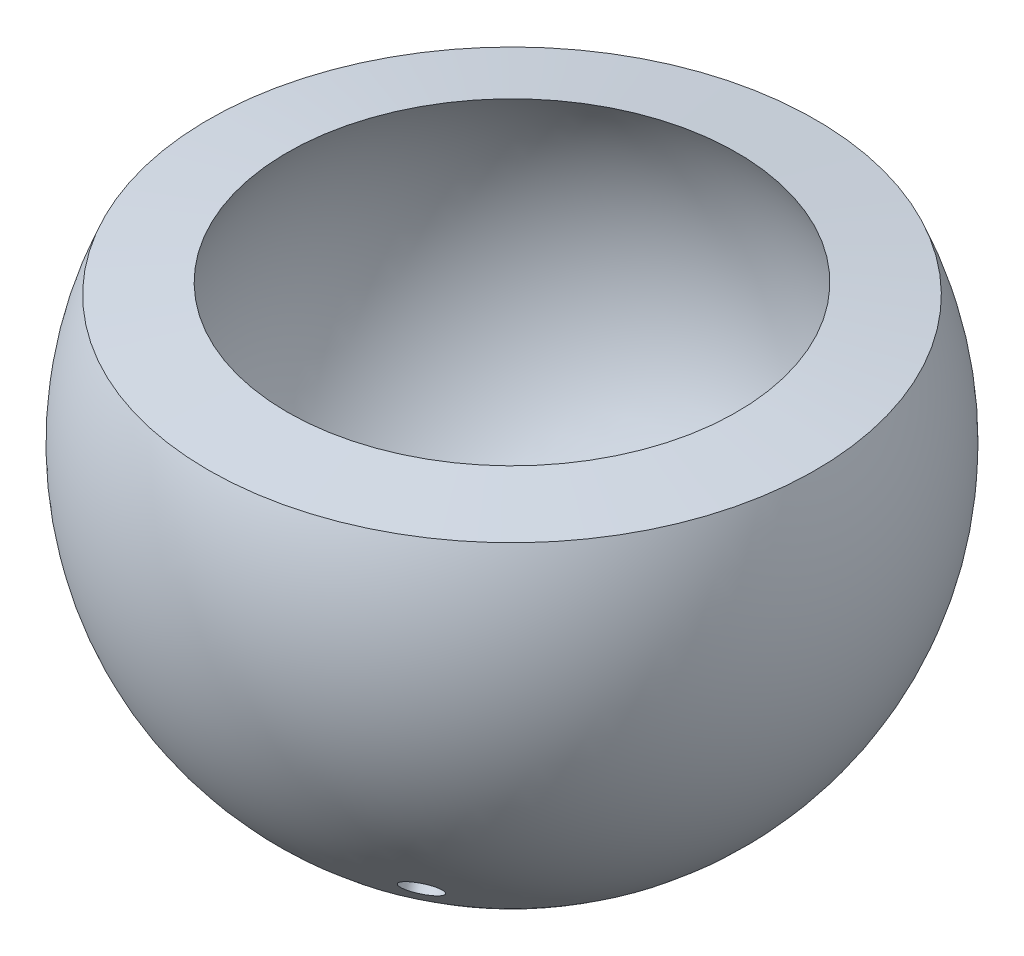
ISO-10303-21;
HEADER;
FILE_DESCRIPTION(('STEP AP214'),'2;1');
FILE_NAME('part.step','',(''),(''),'','','');
FILE_SCHEMA(('AUTOMOTIVE_DESIGN { 1 0 10303 214 1 1 1 1 }'));
ENDSEC;
DATA;
#1=APPLICATION_CONTEXT('core data for automotive mechanical design processes');
#2=APPLICATION_PROTOCOL_DEFINITION('international standard','automotive_design',2000,#1);
#3=PRODUCT_CONTEXT('',#1,'mechanical');
#4=PRODUCT('Part','Part','',(#3));
#5=PRODUCT_RELATED_PRODUCT_CATEGORY('part','',(#4));
#6=PRODUCT_DEFINITION_FORMATION('','',#4);
#7=PRODUCT_DEFINITION_CONTEXT('part definition',#1,'design');
#8=PRODUCT_DEFINITION('design','',#6,#7);
#9=PRODUCT_DEFINITION_SHAPE('','',#8);
#10=(LENGTH_UNIT() NAMED_UNIT(*) SI_UNIT(.MILLI.,.METRE.));
#11=(NAMED_UNIT(*) PLANE_ANGLE_UNIT() SI_UNIT($,.RADIAN.));
#12=(NAMED_UNIT(*) SI_UNIT($,.STERADIAN.) SOLID_ANGLE_UNIT());
#13=UNCERTAINTY_MEASURE_WITH_UNIT(LENGTH_MEASURE(1.E-05),#10,'distance_accuracy_value','');
#14=(GEOMETRIC_REPRESENTATION_CONTEXT(3) GLOBAL_UNCERTAINTY_ASSIGNED_CONTEXT((#13)) GLOBAL_UNIT_ASSIGNED_CONTEXT((#10,
#11,#12)) REPRESENTATION_CONTEXT('',''));
#15=CARTESIAN_POINT('',(0.,0.,0.));
#16=DIRECTION('',(0.,0.,1.));
#17=DIRECTION('',(1.,0.,0.));
#18=AXIS2_PLACEMENT_3D('',#15,#16,#17);
#19=CARTESIAN_POINT('',(0.,0.,0.));
#20=DIRECTION('',(0.,1.,0.));
#21=DIRECTION('',(1.,0.,0.));
#22=AXIS2_PLACEMENT_3D('',#19,#20,#21);
#23=SPHERICAL_SURFACE('',#22,48.133);
#24=CARTESIAN_POINT('',(0.,-48.0659348083443,0.));
#25=DIRECTION('',(0.,1.,0.));
#26=DIRECTION('',(0.,0.,1.));
#27=AXIS2_PLACEMENT_3D('',#24,#25,#26);
#28=CIRCLE('',#27,2.54);
#29=CARTESIAN_POINT('',(0.,-48.0659348083443,2.54));
#30=VERTEX_POINT('',#29);
#31=EDGE_CURVE('E64',#30,#30,#28,.T.);
#32=ORIENTED_EDGE('',*,*,#31,.T.);
#33=EDGE_LOOP('',(#32));
#34=FACE_BOUND('',#33,.T.);
#35=CARTESIAN_POINT('',(18.0626840866516,-31.7053179459417,-31.2854865591471));
#36=DIRECTION('',(-0.375794978177357,0.659630606860158,0.650895995432434));
#37=DIRECTION('',(0.,-0.702378340333676,0.711803812177282));
#38=AXIS2_PLACEMENT_3D('',#35,#36,#37);
#39=CIRCLE('',#38,2.5527);
#40=CARTESIAN_POINT('',(18.0626840866516,-33.4982791353114,-29.4684649678021));
#41=VERTEX_POINT('',#40);
#42=EDGE_CURVE('E58',#41,#41,#39,.T.);
#43=ORIENTED_EDGE('',*,*,#42,.T.);
#44=EDGE_LOOP('',(#43));
#45=FACE_BOUND('',#44,.T.);
#46=CARTESIAN_POINT('',(18.062684086652,-31.7053179459417,31.2854865591468));
#47=DIRECTION('',(-0.375794978177366,0.659630606860158,-0.650895995432429));
#48=DIRECTION('',(0.,0.702378340333673,0.711803812177285));
#49=AXIS2_PLACEMENT_3D('',#46,#47,#48);
#50=CIRCLE('',#49,2.5527);
#51=CARTESIAN_POINT('',(18.062684086652,-29.9123567565719,33.1025081504918));
#52=VERTEX_POINT('',#51);
#53=EDGE_CURVE('E52',#52,#52,#50,.T.);
#54=ORIENTED_EDGE('',*,*,#53,.T.);
#55=EDGE_LOOP('',(#54));
#56=FACE_BOUND('',#55,.T.);
#57=CARTESIAN_POINT('',(-36.1253681733038,-31.7053179459417,0.));
#58=DIRECTION('',(0.751589956354726,0.659630606860158,0.));
#59=DIRECTION('',(-0.659630606860158,0.751589956354726,0.));
#60=AXIS2_PLACEMENT_3D('',#57,#58,#59);
#61=CIRCLE('',#60,2.55269999999999);
#62=CARTESIAN_POINT('',(-34.4415291231719,-33.6239016275284,0.));
#63=VERTEX_POINT('',#62);
#64=EDGE_CURVE('E44',#63,#63,#61,.T.);
#65=ORIENTED_EDGE('',*,*,#64,.T.);
#66=EDGE_LOOP('',(#65));
#67=FACE_BOUND('',#66,.T.);
#68=CARTESIAN_POINT('',(0.,18.7325,0.));
#69=DIRECTION('',(0.,1.,0.));
#70=DIRECTION('',(0.,0.,1.));
#71=AXIS2_PLACEMENT_3D('',#68,#69,#70);
#72=CIRCLE('',#71,44.3382355619842);
#73=CARTESIAN_POINT('',(0.,18.7325,44.3382355619842));
#74=VERTEX_POINT('',#73);
#75=EDGE_CURVE('E10',#74,#74,#72,.T.);
#76=ORIENTED_EDGE('',*,*,#75,.F.);
#77=EDGE_LOOP('',(#76));
#78=FACE_BOUND('',#77,.T.);
#79=ADVANCED_FACE('F33',(#34,#45,#56,#67,#78),#23,.T.);
#80=CARTESIAN_POINT('',(0.,20.32,0.));
#81=DIRECTION('',(0.,-1.,0.));
#82=DIRECTION('',(0.,0.,-1.));
#83=AXIS2_PLACEMENT_3D('',#80,#81,#82);
#84=CONICAL_SURFACE('',#83,32.8279646642919,1.43374068787603);
#85=ORIENTED_EDGE('',*,*,#75,.T.);
#86=EDGE_LOOP('',(#85));
#87=FACE_BOUND('',#86,.T.);
#88=CARTESIAN_POINT('',(0.,20.32,0.));
#89=DIRECTION('',(0.,1.,0.));
#90=DIRECTION('',(0.,0.,1.));
#91=AXIS2_PLACEMENT_3D('',#88,#89,#90);
#92=CIRCLE('',#91,32.8279646642919);
#93=CARTESIAN_POINT('',(0.,20.32,32.8279646642919));
#94=VERTEX_POINT('',#93);
#95=EDGE_CURVE('E40',#94,#94,#92,.T.);
#96=ORIENTED_EDGE('',*,*,#95,.F.);
#97=EDGE_LOOP('',(#96));
#98=FACE_BOUND('',#97,.T.);
#99=ADVANCED_FACE('F78',(#87,#98),#84,.T.);
#100=CARTESIAN_POINT('',(0.,0.,0.));
#101=DIRECTION('',(0.,1.,0.));
#102=DIRECTION('',(1.,0.,0.));
#103=AXIS2_PLACEMENT_3D('',#100,#101,#102);
#104=SPHERICAL_SURFACE('',#103,38.608);
#105=CARTESIAN_POINT('',(0.,-38.5243567629623,0.));
#106=DIRECTION('',(0.,1.,0.));
#107=DIRECTION('',(0.,0.,1.));
#108=AXIS2_PLACEMENT_3D('',#105,#106,#107);
#109=CIRCLE('',#108,2.54);
#110=CARTESIAN_POINT('',(0.,-38.5243567629623,2.54));
#111=VERTEX_POINT('',#110);
#112=EDGE_CURVE('E36',#111,#111,#109,.T.);
#113=ORIENTED_EDGE('',*,*,#112,.F.);
#114=EDGE_LOOP('',(#113));
#115=FACE_BOUND('',#114,.T.);
#116=CARTESIAN_POINT('',(14.476944350612,-25.4112911082279,-25.0748031536078));
#117=DIRECTION('',(-0.375794978177357,0.659630606860158,0.650895995432434));
#118=DIRECTION('',(0.,-0.702378340333676,0.711803812177282));
#119=AXIS2_PLACEMENT_3D('',#116,#117,#118);
#120=CIRCLE('',#119,2.5527);
#121=CARTESIAN_POINT('',(14.476944350612,-27.2042522975976,-23.2577815622629));
#122=VERTEX_POINT('',#121);
#123=EDGE_CURVE('E61',#122,#122,#120,.T.);
#124=ORIENTED_EDGE('',*,*,#123,.F.);
#125=EDGE_LOOP('',(#124));
#126=FACE_BOUND('',#125,.T.);
#127=CARTESIAN_POINT('',(14.4769443506124,-25.4112911082279,25.0748031536076));
#128=DIRECTION('',(-0.375794978177366,0.659630606860158,-0.650895995432429));
#129=DIRECTION('',(0.,0.702378340333673,0.711803812177285));
#130=AXIS2_PLACEMENT_3D('',#127,#128,#129);
#131=CIRCLE('',#130,2.5527);
#132=CARTESIAN_POINT('',(14.4769443506124,-23.6183299188581,26.8918247449526));
#133=VERTEX_POINT('',#132);
#134=EDGE_CURVE('E55',#133,#133,#131,.T.);
#135=ORIENTED_EDGE('',*,*,#134,.F.);
#136=EDGE_LOOP('',(#135));
#137=FACE_BOUND('',#136,.T.);
#138=CARTESIAN_POINT('',(-28.9538887012246,-25.4112911082279,0.));
#139=DIRECTION('',(0.751589956354726,0.659630606860158,0.));
#140=DIRECTION('',(-0.659630606860158,0.751589956354726,0.));
#141=AXIS2_PLACEMENT_3D('',#138,#139,#140);
#142=CIRCLE('',#141,2.55269999999999);
#143=CARTESIAN_POINT('',(-27.2700496510926,-27.3298747898146,0.));
#144=VERTEX_POINT('',#143);
#145=EDGE_CURVE('E49',#144,#144,#142,.T.);
#146=ORIENTED_EDGE('',*,*,#145,.F.);
#147=EDGE_LOOP('',(#146));
#148=FACE_BOUND('',#147,.T.);
#149=ORIENTED_EDGE('',*,*,#95,.T.);
#150=EDGE_LOOP('',(#149));
#151=FACE_BOUND('',#150,.T.);
#152=ADVANCED_FACE('F74',(#115,#126,#137,#148,#151),#104,.F.);
#153=CARTESIAN_POINT('',(-36.176279369222,-31.75,0.));
#154=DIRECTION('',(-0.751589956354726,-0.659630606860158,0.));
#155=DIRECTION('',(0.659630606860158,-0.751589956354726,0.));
#156=AXIS2_PLACEMENT_3D('',#153,#154,#155);
#157=CYLINDRICAL_SURFACE('',#156,2.55269999999999);
#158=CARTESIAN_POINT('',(-27.2700496510926,-27.3298747898146,0.));
#159=CARTESIAN_POINT('',(-27.3447525622601,-27.3954375693741,0.));
#160=CARTESIAN_POINT('',(-27.4194554734276,-27.4610003489336,0.));
#161=CARTESIAN_POINT('',(-27.5688612957626,-27.5921259080526,0.));
#162=CARTESIAN_POINT('',(-27.6435642069301,-27.6576886876122,0.));
#163=CARTESIAN_POINT('',(-27.7929700292651,-27.7888142467312,0.));
#164=CARTESIAN_POINT('',(-27.8676729404326,-27.8543770262907,0.));
#165=CARTESIAN_POINT('',(-28.0170787627676,-27.9855025854098,0.));
#166=CARTESIAN_POINT('',(-28.091781673935,-28.0510653649693,0.));
#167=CARTESIAN_POINT('',(-28.24118749627,-28.1821909240883,0.));
#168=CARTESIAN_POINT('',(-28.3158904074375,-28.2477537036478,0.));
#169=CARTESIAN_POINT('',(-28.4652962297725,-28.3788792627669,0.));
#170=CARTESIAN_POINT('',(-28.53999914094,-28.4444420423264,0.));
#171=CARTESIAN_POINT('',(-28.689404963275,-28.5755676014454,0.));
#172=CARTESIAN_POINT('',(-28.7641078744425,-28.6411303810049,0.));
#173=CARTESIAN_POINT('',(-28.9135136967775,-28.772255940124,0.));
#174=CARTESIAN_POINT('',(-28.988216607945,-28.8378187196835,0.));
#175=CARTESIAN_POINT('',(-29.1376224302799,-28.9689442788025,0.));
#176=CARTESIAN_POINT('',(-29.2123253414474,-29.0345070583621,0.));
#177=CARTESIAN_POINT('',(-29.3617311637824,-29.1656326174811,0.));
#178=CARTESIAN_POINT('',(-29.4364340749499,-29.2311953970406,0.));
#179=CARTESIAN_POINT('',(-29.5858398972849,-29.3623209561597,0.));
#180=CARTESIAN_POINT('',(-29.6605428084524,-29.4278837357192,0.));
#181=CARTESIAN_POINT('',(-29.8099486307874,-29.5590092948382,0.));
#182=CARTESIAN_POINT('',(-29.8846515419549,-29.6245720743977,0.));
#183=CARTESIAN_POINT('',(-30.0340573642898,-29.7556976335168,0.));
#184=CARTESIAN_POINT('',(-30.1087602754573,-29.8212604130763,0.));
#185=CARTESIAN_POINT('',(-30.2581660977923,-29.9523859721953,0.));
#186=CARTESIAN_POINT('',(-30.3328690089598,-30.0179487517548,0.));
#187=CARTESIAN_POINT('',(-30.4822748312948,-30.1490743108739,0.));
#188=CARTESIAN_POINT('',(-30.5569777424623,-30.2146370904334,0.));
#189=CARTESIAN_POINT('',(-30.7063835647973,-30.3457626495524,0.));
#190=CARTESIAN_POINT('',(-30.7810864759648,-30.411325429112,0.));
#191=CARTESIAN_POINT('',(-30.9304922982997,-30.542450988231,0.));
#192=CARTESIAN_POINT('',(-31.0051952094672,-30.6080137677905,0.));
#193=CARTESIAN_POINT('',(-31.1546010318022,-30.7391393269095,0.));
#194=CARTESIAN_POINT('',(-31.2293039429697,-30.8047021064691,0.));
#195=CARTESIAN_POINT('',(-31.3787097653047,-30.9358276655881,0.));
#196=CARTESIAN_POINT('',(-31.4534126764722,-31.0013904451476,0.));
#197=CARTESIAN_POINT('',(-31.6028184988072,-31.1325160042667,0.));
#198=CARTESIAN_POINT('',(-31.6775214099747,-31.1980787838262,0.));
#199=CARTESIAN_POINT('',(-31.8269272323097,-31.3292043429452,0.));
#200=CARTESIAN_POINT('',(-31.9016301434771,-31.3947671225047,0.));
#201=CARTESIAN_POINT('',(-32.0510359658121,-31.5258926816238,0.));
#202=CARTESIAN_POINT('',(-32.1257388769796,-31.5914554611833,0.));
#203=CARTESIAN_POINT('',(-32.2751446993146,-31.7225810203023,0.));
#204=CARTESIAN_POINT('',(-32.3498476104821,-31.7881437998618,0.));
#205=CARTESIAN_POINT('',(-32.4992534328171,-31.9192693589809,0.));
#206=CARTESIAN_POINT('',(-32.5739563439846,-31.9848321385404,0.));
#207=CARTESIAN_POINT('',(-32.7233621663195,-32.1159576976594,0.));
#208=CARTESIAN_POINT('',(-32.798065077487,-32.181520477219,0.));
#209=CARTESIAN_POINT('',(-32.947470899822,-32.312646036338,0.));
#210=CARTESIAN_POINT('',(-33.0221738109895,-32.3782088158975,0.));
#211=CARTESIAN_POINT('',(-33.1715796333245,-32.5093343750165,0.));
#212=CARTESIAN_POINT('',(-33.246282544492,-32.5748971545761,0.));
#213=CARTESIAN_POINT('',(-33.395688366827,-32.7060227136951,0.));
#214=CARTESIAN_POINT('',(-33.4703912779945,-32.7715854932546,0.));
#215=CARTESIAN_POINT('',(-33.6197971003294,-32.9027110523737,0.));
#216=CARTESIAN_POINT('',(-33.6945000114969,-32.9682738319332,0.));
#217=CARTESIAN_POINT('',(-33.8439058338319,-33.0993993910522,0.));
#218=CARTESIAN_POINT('',(-33.9186087449994,-33.1649621706117,0.));
#219=CARTESIAN_POINT('',(-34.0680145673344,-33.2960877297308,0.));
#220=CARTESIAN_POINT('',(-34.1427174785019,-33.3616505092903,0.));
#221=CARTESIAN_POINT('',(-34.2921233008369,-33.4927760684093,0.));
#222=CARTESIAN_POINT('',(-34.3668262120044,-33.5583388479688,0.));
#223=CARTESIAN_POINT('',(-34.4415291231719,-33.6239016275284,0.));
#224=B_SPLINE_CURVE_WITH_KNOTS('',3,(#158,#159,#160,#161,#162,#163,#164,#165,#166,#167,#168,
#169,#170,#171,#172,#173,#174,#175,#176,#177,#178,#179,#180,#181,#182,#183,#184,#185,#186,#187,
#188,#189,#190,#191,#192,#193,#194,#195,#196,#197,#198,#199,#200,#201,#202,#203,#204,#205,#206,
#207,#208,#209,#210,#211,#212,#213,#214,#215,#216,#217,#218,#219,#220,#221,#222,#223),
.UNSPECIFIED.,.F.,.F.,(4,2,2,2,2,2,2,2,2,2,2,2,2,2,2,2,2,2,2,2,2,2,2,2,2,2,2,2,2,2,2,2,4),(0.,
0.298179521436691,0.596359042873383,0.894538564310074,1.19271808574676,1.49089760718345,
1.78907712862015,2.08725665005684,2.38543617149353,2.68361569293022,2.98179521436691,
3.2799747358036,3.57815425724029,3.87633377867698,4.17451330011367,4.47269282155036,
4.77087234298706,5.06905186442375,5.36723138586044,5.66541090729713,5.96359042873382,
6.26176995017051,6.5599494716072,6.85812899304389,7.15630851448059,7.45448803591728,
7.75266755735397,8.05084707879066,8.34902660022735,8.64720612166404,8.94538564310073,
9.24356516453742,9.54174468597411),.UNSPECIFIED.);
#225=EDGE_CURVE('BSEAM77',#144,#63,#224,.T.);
#226=ORIENTED_EDGE('',*,*,#145,.T.);
#227=ORIENTED_EDGE('',*,*,#64,.F.);
#228=ORIENTED_EDGE('',*,*,#225,.T.);
#229=ORIENTED_EDGE('',*,*,#225,.F.);
#230=EDGE_LOOP('',(#226,#228,#227,#229));
#231=FACE_BOUND('',#230,.T.);
#232=ADVANCED_FACE('F77',(#231),#157,.F.);
#233=CARTESIAN_POINT('',(18.0881396846112,-31.75,31.3295769481491));
#234=DIRECTION('',(0.375794978177366,-0.659630606860158,0.650895995432429));
#235=DIRECTION('',(0.,-0.702378340333673,-0.711803812177285));
#236=AXIS2_PLACEMENT_3D('',#233,#234,#235);
#237=CYLINDRICAL_SURFACE('',#236,2.5527);
#238=ORIENTED_EDGE('',*,*,#134,.T.);
#239=EDGE_LOOP('',(#238));
#240=FACE_BOUND('',#239,.T.);
#241=ORIENTED_EDGE('',*,*,#53,.F.);
#242=EDGE_LOOP('',(#241));
#243=FACE_BOUND('',#242,.T.);
#244=ADVANCED_FACE('F95',(#240,#243),#237,.F.);
#245=CARTESIAN_POINT('',(18.0881396846107,-31.75,-31.3295769481493));
#246=DIRECTION('',(0.375794978177357,-0.659630606860158,-0.650895995432434));
#247=DIRECTION('',(0.,0.702378340333676,-0.711803812177282));
#248=AXIS2_PLACEMENT_3D('',#245,#246,#247);
#249=CYLINDRICAL_SURFACE('',#248,2.5527);
#250=ORIENTED_EDGE('',*,*,#123,.T.);
#251=EDGE_LOOP('',(#250));
#252=FACE_BOUND('',#251,.T.);
#253=ORIENTED_EDGE('',*,*,#42,.F.);
#254=EDGE_LOOP('',(#253));
#255=FACE_BOUND('',#254,.T.);
#256=ADVANCED_FACE('F99',(#252,#255),#249,.F.);
#257=CARTESIAN_POINT('',(0.,-48.133,0.));
#258=DIRECTION('',(0.,1.,0.));
#259=DIRECTION('',(0.,0.,1.));
#260=AXIS2_PLACEMENT_3D('',#257,#258,#259);
#261=CYLINDRICAL_SURFACE('',#260,2.54);
#262=ORIENTED_EDGE('',*,*,#112,.T.);
#263=EDGE_LOOP('',(#262));
#264=FACE_BOUND('',#263,.T.);
#265=ORIENTED_EDGE('',*,*,#31,.F.);
#266=EDGE_LOOP('',(#265));
#267=FACE_BOUND('',#266,.T.);
#268=ADVANCED_FACE('F71',(#264,#267),#261,.F.);
#269=CLOSED_SHELL('',(#79,#99,#152,#232,#244,#256,#268));
#270=MANIFOLD_SOLID_BREP('B2',#269);
#271=ADVANCED_BREP_SHAPE_REPRESENTATION('',(#18,#270),#14);
#272=SHAPE_DEFINITION_REPRESENTATION(#9,#271);
ENDSEC;
END-ISO-10303-21;
